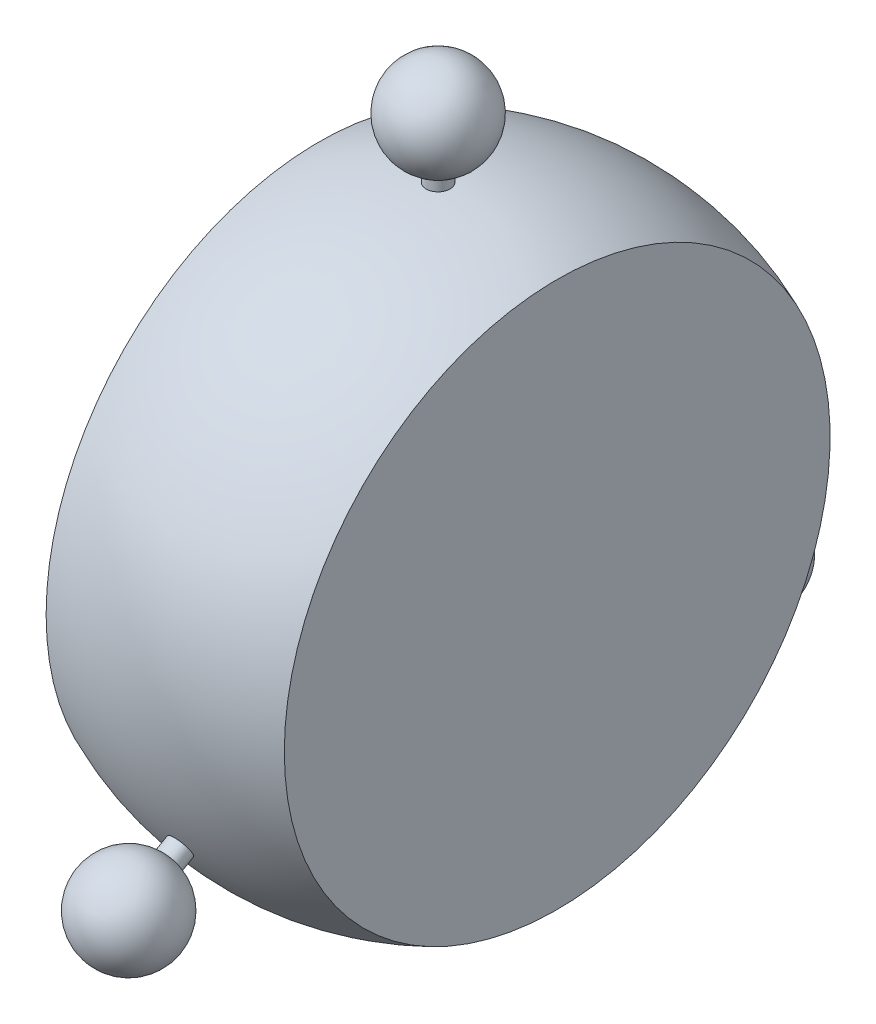
ISO-10303-21;
HEADER;
FILE_DESCRIPTION(('STEP AP214'),'2;1');
FILE_NAME('part.step','',(''),(''),'','','');
FILE_SCHEMA(('AUTOMOTIVE_DESIGN { 1 0 10303 214 1 1 1 1 }'));
ENDSEC;
DATA;
#1=APPLICATION_CONTEXT('core data for automotive mechanical design processes');
#2=APPLICATION_PROTOCOL_DEFINITION('international standard','automotive_design',2000,#1);
#3=PRODUCT_CONTEXT('',#1,'mechanical');
#4=PRODUCT('Part','Part','',(#3));
#5=PRODUCT_RELATED_PRODUCT_CATEGORY('part','',(#4));
#6=PRODUCT_DEFINITION_FORMATION('','',#4);
#7=PRODUCT_DEFINITION_CONTEXT('part definition',#1,'design');
#8=PRODUCT_DEFINITION('design','',#6,#7);
#9=PRODUCT_DEFINITION_SHAPE('','',#8);
#10=(LENGTH_UNIT() NAMED_UNIT(*) SI_UNIT(.MILLI.,.METRE.));
#11=(NAMED_UNIT(*) PLANE_ANGLE_UNIT() SI_UNIT($,.RADIAN.));
#12=(NAMED_UNIT(*) SI_UNIT($,.STERADIAN.) SOLID_ANGLE_UNIT());
#13=UNCERTAINTY_MEASURE_WITH_UNIT(LENGTH_MEASURE(1.E-05),#10,'distance_accuracy_value','');
#14=(GEOMETRIC_REPRESENTATION_CONTEXT(3) GLOBAL_UNCERTAINTY_ASSIGNED_CONTEXT((#13)) GLOBAL_UNIT_ASSIGNED_CONTEXT((#10,
#11,#12)) REPRESENTATION_CONTEXT('',''));
#15=CARTESIAN_POINT('',(0.,0.,0.));
#16=DIRECTION('',(0.,0.,1.));
#17=DIRECTION('',(1.,0.,0.));
#18=AXIS2_PLACEMENT_3D('',#15,#16,#17);
#19=CARTESIAN_POINT('',(-20.,0.,0.));
#20=DIRECTION('',(-1.,0.,0.));
#21=DIRECTION('',(0.,1.,0.));
#22=AXIS2_PLACEMENT_3D('',#19,#20,#21);
#23=SPHERICAL_SURFACE('',#22,20.);
#24=CARTESIAN_POINT('',(-9.99999999999999,0.,0.));
#25=DIRECTION('',(-1.,0.,0.));
#26=DIRECTION('',(0.,0.,1.));
#27=AXIS2_PLACEMENT_3D('',#24,#25,#26);
#28=CIRCLE('',#27,17.3205080756888);
#29=CARTESIAN_POINT('',(-9.99999999999999,0.,17.3205080756888));
#30=VERTEX_POINT('',#29);
#31=EDGE_CURVE('E10',#30,#30,#28,.T.);
#32=ORIENTED_EDGE('',*,*,#31,.T.);
#33=EDGE_LOOP('',(#32));
#34=FACE_BOUND('',#33,.T.);
#35=ADVANCED_FACE('F30',(#34),#23,.F.);
#36=CARTESIAN_POINT('',(-9.99999999999999,22.9128784747792,0.));
#37=DIRECTION('',(1.,0.,0.));
#38=DIRECTION('',(0.,0.,-1.));
#39=AXIS2_PLACEMENT_3D('',#36,#37,#38);
#40=PLANE('',#39);
#41=ORIENTED_EDGE('',*,*,#31,.F.);
#42=EDGE_LOOP('',(#41));
#43=FACE_BOUND('',#42,.T.);
#44=CARTESIAN_POINT('',(-10.,0.,0.));
#45=DIRECTION('',(-1.,0.,0.));
#46=DIRECTION('',(0.,0.,1.));
#47=AXIS2_PLACEMENT_3D('',#44,#45,#46);
#48=CIRCLE('',#47,22.9128784747792);
#49=CARTESIAN_POINT('',(-10.,0.,22.9128784747792));
#50=VERTEX_POINT('',#49);
#51=EDGE_CURVE('E36',#50,#50,#48,.T.);
#52=ORIENTED_EDGE('',*,*,#51,.T.);
#53=EDGE_LOOP('',(#52));
#54=FACE_BOUND('',#53,.T.);
#55=ADVANCED_FACE('F77',(#43,#54),#40,.F.);
#56=CARTESIAN_POINT('',(0.,0.,0.));
#57=DIRECTION('',(-1.,0.,0.));
#58=DIRECTION('',(0.,1.,0.));
#59=AXIS2_PLACEMENT_3D('',#56,#57,#58);
#60=SPHERICAL_SURFACE('',#59,25.);
#61=CARTESIAN_POINT('',(0.,-12.4899959967966,21.6333076527841));
#62=DIRECTION('',(0.,0.499999999999993,-0.866025403784443));
#63=DIRECTION('',(0.,0.866025403784443,0.499999999999993));
#64=AXIS2_PLACEMENT_3D('',#61,#62,#63);
#65=CIRCLE('',#64,0.999999999999998);
#66=CARTESIAN_POINT('',(0.,-11.6239705930122,22.1333076527841));
#67=VERTEX_POINT('',#66);
#68=EDGE_CURVE('E58',#67,#67,#65,.T.);
#69=ORIENTED_EDGE('',*,*,#68,.T.);
#70=EDGE_LOOP('',(#69));
#71=FACE_BOUND('',#70,.T.);
#72=CARTESIAN_POINT('',(0.,-12.4899959967969,-21.6333076527839));
#73=DIRECTION('',(0.,0.500000000000003,0.866025403784437));
#74=DIRECTION('',(0.,-0.866025403784437,0.500000000000003));
#75=AXIS2_PLACEMENT_3D('',#72,#73,#74);
#76=CIRCLE('',#75,0.999999999999998);
#77=CARTESIAN_POINT('',(0.,-13.3560214005813,-21.1333076527839));
#78=VERTEX_POINT('',#77);
#79=EDGE_CURVE('E52',#78,#78,#76,.T.);
#80=ORIENTED_EDGE('',*,*,#79,.T.);
#81=EDGE_LOOP('',(#80));
#82=FACE_BOUND('',#81,.T.);
#83=CARTESIAN_POINT('',(0.,24.9799919935936,0.));
#84=DIRECTION('',(0.,-1.,0.));
#85=DIRECTION('',(0.,0.,-1.));
#86=AXIS2_PLACEMENT_3D('',#83,#84,#85);
#87=CIRCLE('',#86,0.999999999999998);
#88=CARTESIAN_POINT('',(0.,24.9799919935936,-1.));
#89=VERTEX_POINT('',#88);
#90=EDGE_CURVE('E44',#89,#89,#87,.T.);
#91=ORIENTED_EDGE('',*,*,#90,.T.);
#92=EDGE_LOOP('',(#91));
#93=FACE_BOUND('',#92,.T.);
#94=ORIENTED_EDGE('',*,*,#51,.F.);
#95=EDGE_LOOP('',(#94));
#96=FACE_BOUND('',#95,.T.);
#97=CARTESIAN_POINT('',(9.99999999999999,0.,0.));
#98=DIRECTION('',(-1.,0.,0.));
#99=DIRECTION('',(0.,0.,1.));
#100=AXIS2_PLACEMENT_3D('',#97,#98,#99);
#101=CIRCLE('',#100,22.9128784747792);
#102=CARTESIAN_POINT('',(9.99999999999999,0.,22.9128784747792));
#103=VERTEX_POINT('',#102);
#104=EDGE_CURVE('E40',#103,#103,#101,.T.);
#105=ORIENTED_EDGE('',*,*,#104,.T.);
#106=EDGE_LOOP('',(#105));
#107=FACE_BOUND('',#106,.T.);
#108=ADVANCED_FACE('F81',(#71,#82,#93,#96,#107),#60,.T.);
#109=CARTESIAN_POINT('',(9.99999999999999,22.9128784747792,0.));
#110=DIRECTION('',(-1.,0.,0.));
#111=DIRECTION('',(0.,0.,1.));
#112=AXIS2_PLACEMENT_3D('',#109,#110,#111);
#113=PLANE('',#112);
#114=ORIENTED_EDGE('',*,*,#104,.F.);
#115=EDGE_LOOP('',(#114));
#116=FACE_BOUND('',#115,.T.);
#117=ADVANCED_FACE('F86',(#116),#113,.F.);
#118=CARTESIAN_POINT('',(0.,25.,0.));
#119=DIRECTION('',(0.,-1.,0.));
#120=DIRECTION('',(0.,0.,-1.));
#121=AXIS2_PLACEMENT_3D('',#118,#119,#120);
#122=CYLINDRICAL_SURFACE('',#121,1.);
#123=CARTESIAN_POINT('',(0.,26.1270166537926,0.));
#124=DIRECTION('',(0.,-1.,0.));
#125=DIRECTION('',(0.,0.,-1.));
#126=AXIS2_PLACEMENT_3D('',#123,#124,#125);
#127=CIRCLE('',#126,1.);
#128=CARTESIAN_POINT('',(0.,26.1270166537926,-1.));
#129=VERTEX_POINT('',#128);
#130=EDGE_CURVE('E49',#129,#129,#127,.T.);
#131=ORIENTED_EDGE('',*,*,#130,.T.);
#132=EDGE_LOOP('',(#131));
#133=FACE_BOUND('',#132,.T.);
#134=ORIENTED_EDGE('',*,*,#90,.F.);
#135=EDGE_LOOP('',(#134));
#136=FACE_BOUND('',#135,.T.);
#137=ADVANCED_FACE('F92',(#133,#136),#122,.T.);
#138=CARTESIAN_POINT('',(0.,30.,0.));
#139=DIRECTION('',(0.,-1.,0.));
#140=DIRECTION('',(0.,0.,-1.));
#141=AXIS2_PLACEMENT_3D('',#138,#139,#140);
#142=SPHERICAL_SURFACE('',#141,4.);
#143=ORIENTED_EDGE('',*,*,#130,.F.);
#144=EDGE_LOOP('',(#143));
#145=FACE_BOUND('',#144,.T.);
#146=ADVANCED_FACE('F96',(#145),#142,.T.);
#147=CARTESIAN_POINT('',(0.,-12.5000000000001,-21.6506350946109));
#148=DIRECTION('',(0.,0.500000000000003,0.866025403784437));
#149=DIRECTION('',(0.,-0.866025403784437,0.500000000000003));
#150=AXIS2_PLACEMENT_3D('',#147,#148,#149);
#151=CYLINDRICAL_SURFACE('',#150,1.);
#152=CARTESIAN_POINT('',(0.,-13.0635083268964,-22.6266601472834));
#153=DIRECTION('',(0.,0.500000000000003,0.866025403784437));
#154=DIRECTION('',(0.,-0.866025403784437,0.500000000000003));
#155=AXIS2_PLACEMENT_3D('',#152,#153,#154);
#156=CIRCLE('',#155,1.);
#157=CARTESIAN_POINT('',(0.,-13.9295337306808,-22.1266601472834));
#158=VERTEX_POINT('',#157);
#159=EDGE_CURVE('E55',#158,#158,#156,.T.);
#160=ORIENTED_EDGE('',*,*,#159,.T.);
#161=EDGE_LOOP('',(#160));
#162=FACE_BOUND('',#161,.T.);
#163=ORIENTED_EDGE('',*,*,#79,.F.);
#164=EDGE_LOOP('',(#163));
#165=FACE_BOUND('',#164,.T.);
#166=ADVANCED_FACE('F100',(#162,#165),#151,.T.);
#167=CARTESIAN_POINT('',(0.,-15.0000000000001,-25.9807621135331));
#168=DIRECTION('',(0.,0.500000000000003,0.866025403784437));
#169=DIRECTION('',(0.,-0.866025403784437,0.500000000000003));
#170=AXIS2_PLACEMENT_3D('',#167,#168,#169);
#171=SPHERICAL_SURFACE('',#170,4.);
#172=ORIENTED_EDGE('',*,*,#159,.F.);
#173=EDGE_LOOP('',(#172));
#174=FACE_BOUND('',#173,.T.);
#175=ADVANCED_FACE('F74',(#174),#171,.T.);
#176=CARTESIAN_POINT('',(0.,-12.4999999999998,21.6506350946111));
#177=DIRECTION('',(0.,0.499999999999993,-0.866025403784443));
#178=DIRECTION('',(0.,0.866025403784443,0.499999999999993));
#179=AXIS2_PLACEMENT_3D('',#176,#177,#178);
#180=CYLINDRICAL_SURFACE('',#179,1.);
#181=CARTESIAN_POINT('',(0.,-13.0635083268961,22.6266601472836));
#182=DIRECTION('',(0.,0.499999999999993,-0.866025403784443));
#183=DIRECTION('',(0.,0.866025403784443,0.499999999999993));
#184=AXIS2_PLACEMENT_3D('',#181,#182,#183);
#185=CIRCLE('',#184,1.);
#186=CARTESIAN_POINT('',(0.,-12.1974829231116,23.1266601472836));
#187=VERTEX_POINT('',#186);
#188=EDGE_CURVE('E61',#187,#187,#185,.T.);
#189=ORIENTED_EDGE('',*,*,#188,.T.);
#190=EDGE_LOOP('',(#189));
#191=FACE_BOUND('',#190,.T.);
#192=ORIENTED_EDGE('',*,*,#68,.F.);
#193=EDGE_LOOP('',(#192));
#194=FACE_BOUND('',#193,.T.);
#195=ADVANCED_FACE('F65',(#191,#194),#180,.T.);
#196=CARTESIAN_POINT('',(0.,-14.9999999999998,25.9807621135333));
#197=DIRECTION('',(0.,0.499999999999993,-0.866025403784443));
#198=DIRECTION('',(0.,0.866025403784443,0.499999999999993));
#199=AXIS2_PLACEMENT_3D('',#196,#197,#198);
#200=SPHERICAL_SURFACE('',#199,4.);
#201=ORIENTED_EDGE('',*,*,#188,.F.);
#202=EDGE_LOOP('',(#201));
#203=FACE_BOUND('',#202,.T.);
#204=ADVANCED_FACE('F68',(#203),#200,.T.);
#205=CLOSED_SHELL('',(#35,#55,#108,#117,#137,#146,#166,#175,#195,#204));
#206=MANIFOLD_SOLID_BREP('B2',#205);
#207=ADVANCED_BREP_SHAPE_REPRESENTATION('',(#18,#206),#14);
#208=SHAPE_DEFINITION_REPRESENTATION(#9,#207);
ENDSEC;
END-ISO-10303-21;
